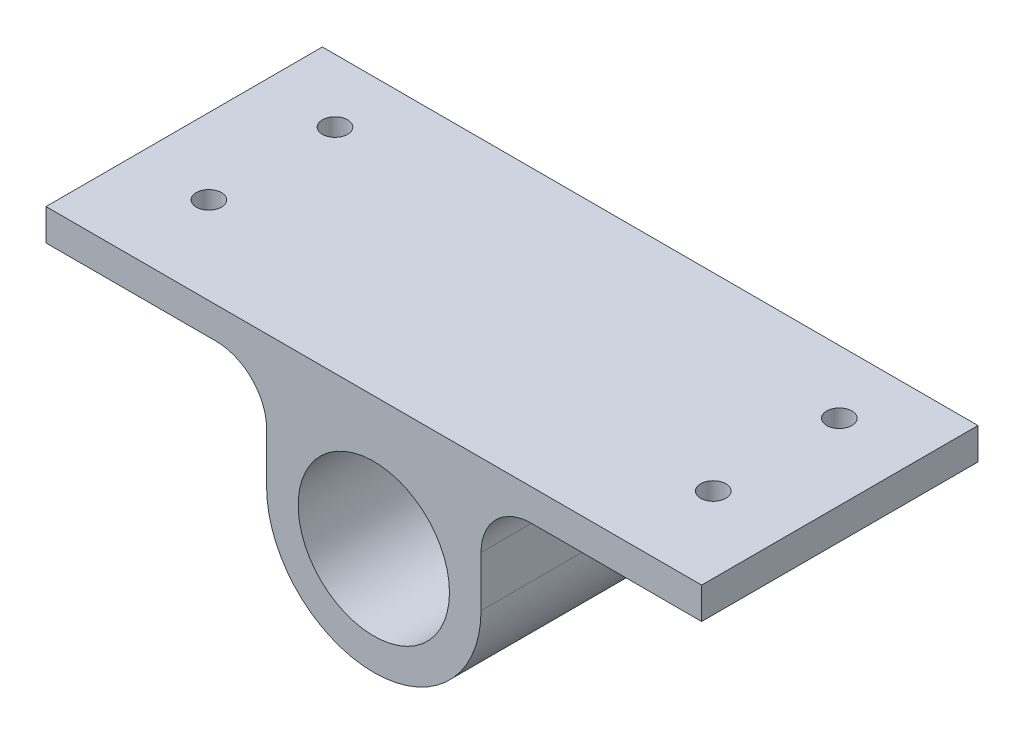
ISO-10303-21;
HEADER;
FILE_DESCRIPTION(('STEP AP214'),'2;1');
FILE_NAME('part.step','',(''),(''),'','','');
FILE_SCHEMA(('AUTOMOTIVE_DESIGN { 1 0 10303 214 1 1 1 1 }'));
ENDSEC;
DATA;
#1=APPLICATION_CONTEXT('core data for automotive mechanical design processes');
#2=APPLICATION_PROTOCOL_DEFINITION('international standard','automotive_design',2000,#1);
#3=PRODUCT_CONTEXT('',#1,'mechanical');
#4=PRODUCT('Part','Part','',(#3));
#5=PRODUCT_RELATED_PRODUCT_CATEGORY('part','',(#4));
#6=PRODUCT_DEFINITION_FORMATION('','',#4);
#7=PRODUCT_DEFINITION_CONTEXT('part definition',#1,'design');
#8=PRODUCT_DEFINITION('design','',#6,#7);
#9=PRODUCT_DEFINITION_SHAPE('','',#8);
#10=(LENGTH_UNIT() NAMED_UNIT(*) SI_UNIT(.MILLI.,.METRE.));
#11=(NAMED_UNIT(*) PLANE_ANGLE_UNIT() SI_UNIT($,.RADIAN.));
#12=(NAMED_UNIT(*) SI_UNIT($,.STERADIAN.) SOLID_ANGLE_UNIT());
#13=UNCERTAINTY_MEASURE_WITH_UNIT(LENGTH_MEASURE(1.E-05),#10,'distance_accuracy_value','');
#14=(GEOMETRIC_REPRESENTATION_CONTEXT(3) GLOBAL_UNCERTAINTY_ASSIGNED_CONTEXT((#13)) GLOBAL_UNIT_ASSIGNED_CONTEXT((#10,
#11,#12)) REPRESENTATION_CONTEXT('',''));
#15=CARTESIAN_POINT('',(0.,0.,0.));
#16=DIRECTION('',(0.,0.,1.));
#17=DIRECTION('',(1.,0.,0.));
#18=AXIS2_PLACEMENT_3D('',#15,#16,#17);
#19=CARTESIAN_POINT('',(0.,-7.9502,69.596));
#20=DIRECTION('',(0.,1.,0.));
#21=DIRECTION('',(0.,0.,1.));
#22=AXIS2_PLACEMENT_3D('',#19,#20,#21);
#23=PLANE('',#22);
#24=CARTESIAN_POINT('',(-63.5,-7.9502,15.875));
#25=DIRECTION('',(0.,1.,0.));
#26=DIRECTION('',(0.,0.,1.));
#27=AXIS2_PLACEMENT_3D('',#24,#25,#26);
#28=CIRCLE('',#27,3.175);
#29=CARTESIAN_POINT('',(-63.5,-7.9502,19.05));
#30=VERTEX_POINT('',#29);
#31=EDGE_CURVE('E165',#30,#30,#28,.T.);
#32=ORIENTED_EDGE('',*,*,#31,.T.);
#33=EDGE_LOOP('',(#32));
#34=FACE_BOUND('',#33,.T.);
#35=CARTESIAN_POINT('',(-63.5,-7.9502,47.625));
#36=DIRECTION('',(0.,1.,0.));
#37=DIRECTION('',(0.,0.,1.));
#38=AXIS2_PLACEMENT_3D('',#35,#36,#37);
#39=CIRCLE('',#38,3.175);
#40=CARTESIAN_POINT('',(-63.5,-7.9502,50.8));
#41=VERTEX_POINT('',#40);
#42=EDGE_CURVE('E333',#41,#41,#39,.T.);
#43=ORIENTED_EDGE('',*,*,#42,.T.);
#44=EDGE_LOOP('',(#43));
#45=FACE_BOUND('',#44,.T.);
#46=DIRECTION('',(1.,0.,0.));
#47=VECTOR('',#46,1.);
#48=CARTESIAN_POINT('',(0.,-7.9502,0.));
#49=LINE('',#48,#47);
#50=CARTESIAN_POINT('',(-82.55,-7.9502,0.));
#51=VERTEX_POINT('',#50);
#52=CARTESIAN_POINT('',(-39.7002000000001,-7.9502,0.));
#53=VERTEX_POINT('',#52);
#54=EDGE_CURVE('E164',#51,#53,#49,.T.);
#55=ORIENTED_EDGE('',*,*,#54,.T.);
#56=DIRECTION('',(0.,0.,-1.));
#57=VECTOR('',#56,1.);
#58=CARTESIAN_POINT('',(-39.7002000000001,-7.9502,69.596));
#59=LINE('',#58,#57);
#60=CARTESIAN_POINT('',(-39.7002000000001,-7.9502,69.596));
#61=VERTEX_POINT('',#60);
#62=EDGE_CURVE('E11',#61,#53,#59,.T.);
#63=ORIENTED_EDGE('',*,*,#62,.F.);
#64=DIRECTION('',(1.,0.,0.));
#65=VECTOR('',#64,1.);
#66=CARTESIAN_POINT('',(0.,-7.9502,69.596));
#67=LINE('',#66,#65);
#68=CARTESIAN_POINT('',(-82.55,-7.9502,69.596));
#69=VERTEX_POINT('',#68);
#70=EDGE_CURVE('E257',#69,#61,#67,.T.);
#71=ORIENTED_EDGE('',*,*,#70,.F.);
#72=DIRECTION('',(0.,0.,-1.));
#73=VECTOR('',#72,1.);
#74=CARTESIAN_POINT('',(-82.55,-7.9502,69.596));
#75=LINE('',#74,#73);
#76=EDGE_CURVE('E156',#69,#51,#75,.T.);
#77=ORIENTED_EDGE('',*,*,#76,.T.);
#78=EDGE_LOOP('',(#55,#63,#71,#77));
#79=FACE_BOUND('',#78,.T.);
#80=ADVANCED_FACE('F47',(#34,#45,#79),#23,.F.);
#81=CARTESIAN_POINT('',(-39.7002,-20.6502,69.596));
#82=DIRECTION('',(0.,0.,-1.));
#83=DIRECTION('',(-1.,0.,0.));
#84=AXIS2_PLACEMENT_3D('',#81,#82,#83);
#85=CYLINDRICAL_SURFACE('',#84,12.7);
#86=CARTESIAN_POINT('',(-39.7002,-20.6502,0.));
#87=DIRECTION('',(0.,0.,1.));
#88=DIRECTION('',(1.,0.,0.));
#89=AXIS2_PLACEMENT_3D('',#86,#87,#88);
#90=CIRCLE('',#89,12.7);
#91=CARTESIAN_POINT('',(-27.0002,-20.6502000000001,0.));
#92=VERTEX_POINT('',#91);
#93=EDGE_CURVE('E169',#53,#92,#90,.F.);
#94=ORIENTED_EDGE('',*,*,#93,.T.);
#95=DIRECTION('',(0.,0.,-1.));
#96=VECTOR('',#95,1.);
#97=CARTESIAN_POINT('',(-27.0002,-20.6502000000001,69.596));
#98=LINE('',#97,#96);
#99=CARTESIAN_POINT('',(-27.0002,-20.6502000000001,69.596));
#100=VERTEX_POINT('',#99);
#101=EDGE_CURVE('E57',#100,#92,#98,.T.);
#102=ORIENTED_EDGE('',*,*,#101,.F.);
#103=CARTESIAN_POINT('',(-39.7002,-20.6502,69.596));
#104=DIRECTION('',(0.,0.,1.));
#105=DIRECTION('',(1.,0.,0.));
#106=AXIS2_PLACEMENT_3D('',#103,#104,#105);
#107=CIRCLE('',#106,12.7);
#108=EDGE_CURVE('E110',#61,#100,#107,.F.);
#109=ORIENTED_EDGE('',*,*,#108,.F.);
#110=ORIENTED_EDGE('',*,*,#62,.T.);
#111=EDGE_LOOP('',(#94,#102,#109,#110));
#112=FACE_BOUND('',#111,.T.);
#113=ADVANCED_FACE('F271',(#112),#85,.F.);
#114=CARTESIAN_POINT('',(-27.0002,0.,69.596));
#115=DIRECTION('',(1.,0.,0.));
#116=DIRECTION('',(0.,0.,-1.));
#117=AXIS2_PLACEMENT_3D('',#114,#115,#116);
#118=PLANE('',#117);
#119=DIRECTION('',(0.,-1.,0.));
#120=VECTOR('',#119,1.);
#121=CARTESIAN_POINT('',(-27.0002,0.,0.));
#122=LINE('',#121,#120);
#123=CARTESIAN_POINT('',(-27.0002,-33.3502,0.));
#124=VERTEX_POINT('',#123);
#125=EDGE_CURVE('E172',#92,#124,#122,.T.);
#126=ORIENTED_EDGE('',*,*,#125,.T.);
#127=DIRECTION('',(0.,0.,-1.));
#128=VECTOR('',#127,1.);
#129=CARTESIAN_POINT('',(-27.0002,-33.3502,69.596));
#130=LINE('',#129,#128);
#131=CARTESIAN_POINT('',(-27.0002,-33.3502,69.596));
#132=VERTEX_POINT('',#131);
#133=EDGE_CURVE('E214',#132,#124,#130,.T.);
#134=ORIENTED_EDGE('',*,*,#133,.F.);
#135=DIRECTION('',(0.,-1.,0.));
#136=VECTOR('',#135,1.);
#137=CARTESIAN_POINT('',(-27.0002,0.,69.596));
#138=LINE('',#137,#136);
#139=EDGE_CURVE('E224',#100,#132,#138,.T.);
#140=ORIENTED_EDGE('',*,*,#139,.F.);
#141=ORIENTED_EDGE('',*,*,#101,.T.);
#142=EDGE_LOOP('',(#126,#134,#140,#141));
#143=FACE_BOUND('',#142,.T.);
#144=ADVANCED_FACE('F222',(#143),#118,.F.);
#145=CARTESIAN_POINT('',(0.,-33.3502,69.596));
#146=DIRECTION('',(0.,0.,-1.));
#147=DIRECTION('',(-1.,0.,0.));
#148=AXIS2_PLACEMENT_3D('',#145,#146,#147);
#149=CYLINDRICAL_SURFACE('',#148,27.0002);
#150=CARTESIAN_POINT('',(0.,-33.3502,0.));
#151=DIRECTION('',(0.,0.,1.));
#152=DIRECTION('',(1.,0.,0.));
#153=AXIS2_PLACEMENT_3D('',#150,#151,#152);
#154=CIRCLE('',#153,27.0002);
#155=CARTESIAN_POINT('',(27.0002,-33.3502,0.));
#156=VERTEX_POINT('',#155);
#157=EDGE_CURVE('E175',#124,#156,#154,.T.);
#158=ORIENTED_EDGE('',*,*,#157,.T.);
#159=DIRECTION('',(0.,0.,-1.));
#160=VECTOR('',#159,1.);
#161=CARTESIAN_POINT('',(27.0002,-33.3502,69.596));
#162=LINE('',#161,#160);
#163=CARTESIAN_POINT('',(27.0002,-33.3502,69.596));
#164=VERTEX_POINT('',#163);
#165=EDGE_CURVE('E211',#164,#156,#162,.T.);
#166=ORIENTED_EDGE('',*,*,#165,.F.);
#167=CARTESIAN_POINT('',(0.,-33.3502,69.596));
#168=DIRECTION('',(0.,0.,1.));
#169=DIRECTION('',(1.,0.,0.));
#170=AXIS2_PLACEMENT_3D('',#167,#168,#169);
#171=CIRCLE('',#170,27.0002);
#172=EDGE_CURVE('E235',#132,#164,#171,.T.);
#173=ORIENTED_EDGE('',*,*,#172,.F.);
#174=ORIENTED_EDGE('',*,*,#133,.T.);
#175=EDGE_LOOP('',(#158,#166,#173,#174));
#176=FACE_BOUND('',#175,.T.);
#177=ADVANCED_FACE('F232',(#176),#149,.T.);
#178=CARTESIAN_POINT('',(27.0002,0.,69.596));
#179=DIRECTION('',(1.,0.,0.));
#180=DIRECTION('',(0.,0.,-1.));
#181=AXIS2_PLACEMENT_3D('',#178,#179,#180);
#182=PLANE('',#181);
#183=DIRECTION('',(0.,-1.,0.));
#184=VECTOR('',#183,1.);
#185=CARTESIAN_POINT('',(27.0002,0.,0.));
#186=LINE('',#185,#184);
#187=CARTESIAN_POINT('',(27.0002,-20.6502000000001,0.));
#188=VERTEX_POINT('',#187);
#189=EDGE_CURVE('E179',#188,#156,#186,.T.);
#190=ORIENTED_EDGE('',*,*,#189,.F.);
#191=DIRECTION('',(0.,0.,-1.));
#192=VECTOR('',#191,1.);
#193=CARTESIAN_POINT('',(27.0002,-20.6502000000001,69.596));
#194=LINE('',#193,#192);
#195=CARTESIAN_POINT('',(27.0002,-20.6502000000001,69.596));
#196=VERTEX_POINT('',#195);
#197=EDGE_CURVE('E208',#196,#188,#194,.T.);
#198=ORIENTED_EDGE('',*,*,#197,.F.);
#199=DIRECTION('',(0.,-1.,0.));
#200=VECTOR('',#199,1.);
#201=CARTESIAN_POINT('',(27.0002,0.,69.596));
#202=LINE('',#201,#200);
#203=EDGE_CURVE('E238',#196,#164,#202,.T.);
#204=ORIENTED_EDGE('',*,*,#203,.T.);
#205=ORIENTED_EDGE('',*,*,#165,.T.);
#206=EDGE_LOOP('',(#190,#198,#204,#205));
#207=FACE_BOUND('',#206,.T.);
#208=ADVANCED_FACE('F286',(#207),#182,.T.);
#209=CARTESIAN_POINT('',(39.7002,-20.6502,69.596));
#210=DIRECTION('',(0.,0.,-1.));
#211=DIRECTION('',(-1.,0.,0.));
#212=AXIS2_PLACEMENT_3D('',#209,#210,#211);
#213=CYLINDRICAL_SURFACE('',#212,12.7);
#214=CARTESIAN_POINT('',(39.7002,-20.6502,0.));
#215=DIRECTION('',(0.,0.,1.));
#216=DIRECTION('',(1.,0.,0.));
#217=AXIS2_PLACEMENT_3D('',#214,#215,#216);
#218=CIRCLE('',#217,12.7);
#219=CARTESIAN_POINT('',(39.7002000000001,-7.9502,0.));
#220=VERTEX_POINT('',#219);
#221=EDGE_CURVE('E183',#220,#188,#218,.T.);
#222=ORIENTED_EDGE('',*,*,#221,.F.);
#223=DIRECTION('',(0.,0.,-1.));
#224=VECTOR('',#223,1.);
#225=CARTESIAN_POINT('',(39.7002000000001,-7.9502,69.596));
#226=LINE('',#225,#224);
#227=CARTESIAN_POINT('',(39.7002000000001,-7.9502,69.596));
#228=VERTEX_POINT('',#227);
#229=EDGE_CURVE('E205',#228,#220,#226,.T.);
#230=ORIENTED_EDGE('',*,*,#229,.F.);
#231=CARTESIAN_POINT('',(39.7002,-20.6502,69.596));
#232=DIRECTION('',(0.,0.,1.));
#233=DIRECTION('',(1.,0.,0.));
#234=AXIS2_PLACEMENT_3D('',#231,#232,#233);
#235=CIRCLE('',#234,12.7);
#236=EDGE_CURVE('E242',#228,#196,#235,.T.);
#237=ORIENTED_EDGE('',*,*,#236,.T.);
#238=ORIENTED_EDGE('',*,*,#197,.T.);
#239=EDGE_LOOP('',(#222,#230,#237,#238));
#240=FACE_BOUND('',#239,.T.);
#241=ADVANCED_FACE('F289',(#240),#213,.F.);
#242=CARTESIAN_POINT('',(0.,-7.9502,69.596));
#243=DIRECTION('',(0.,-1.,0.));
#244=DIRECTION('',(0.,0.,-1.));
#245=AXIS2_PLACEMENT_3D('',#242,#243,#244);
#246=PLANE('',#245);
#247=CARTESIAN_POINT('',(63.5,-7.9502,47.625));
#248=DIRECTION('',(0.,-1.,0.));
#249=DIRECTION('',(0.,0.,-1.));
#250=AXIS2_PLACEMENT_3D('',#247,#248,#249);
#251=CIRCLE('',#250,3.175);
#252=CARTESIAN_POINT('',(63.5,-7.9502,44.45));
#253=VERTEX_POINT('',#252);
#254=EDGE_CURVE('E324',#253,#253,#251,.T.);
#255=ORIENTED_EDGE('',*,*,#254,.F.);
#256=EDGE_LOOP('',(#255));
#257=FACE_BOUND('',#256,.T.);
#258=CARTESIAN_POINT('',(63.5,-7.9502,15.875));
#259=DIRECTION('',(0.,-1.,0.));
#260=DIRECTION('',(0.,0.,-1.));
#261=AXIS2_PLACEMENT_3D('',#258,#259,#260);
#262=CIRCLE('',#261,3.175);
#263=CARTESIAN_POINT('',(63.5,-7.9502,12.7));
#264=VERTEX_POINT('',#263);
#265=EDGE_CURVE('E319',#264,#264,#262,.T.);
#266=ORIENTED_EDGE('',*,*,#265,.F.);
#267=EDGE_LOOP('',(#266));
#268=FACE_BOUND('',#267,.T.);
#269=DIRECTION('',(-1.,0.,0.));
#270=VECTOR('',#269,1.);
#271=CARTESIAN_POINT('',(0.,-7.9502,0.));
#272=LINE('',#271,#270);
#273=CARTESIAN_POINT('',(82.55,-7.9502,0.));
#274=VERTEX_POINT('',#273);
#275=EDGE_CURVE('E187',#274,#220,#272,.T.);
#276=ORIENTED_EDGE('',*,*,#275,.F.);
#277=DIRECTION('',(0.,0.,-1.));
#278=VECTOR('',#277,1.);
#279=CARTESIAN_POINT('',(82.55,-7.9502,69.596));
#280=LINE('',#279,#278);
#281=CARTESIAN_POINT('',(82.55,-7.9502,69.596));
#282=VERTEX_POINT('',#281);
#283=EDGE_CURVE('E142',#282,#274,#280,.T.);
#284=ORIENTED_EDGE('',*,*,#283,.F.);
#285=DIRECTION('',(-1.,0.,0.));
#286=VECTOR('',#285,1.);
#287=CARTESIAN_POINT('',(0.,-7.9502,69.596));
#288=LINE('',#287,#286);
#289=EDGE_CURVE('E149',#282,#228,#288,.T.);
#290=ORIENTED_EDGE('',*,*,#289,.T.);
#291=ORIENTED_EDGE('',*,*,#229,.T.);
#292=EDGE_LOOP('',(#276,#284,#290,#291));
#293=FACE_BOUND('',#292,.T.);
#294=ADVANCED_FACE('F252',(#257,#268,#293),#246,.T.);
#295=CARTESIAN_POINT('',(82.55,0.,69.596));
#296=DIRECTION('',(1.,0.,0.));
#297=DIRECTION('',(0.,0.,-1.));
#298=AXIS2_PLACEMENT_3D('',#295,#296,#297);
#299=PLANE('',#298);
#300=DIRECTION('',(0.,-1.,0.));
#301=VECTOR('',#300,1.);
#302=CARTESIAN_POINT('',(82.55,0.,0.));
#303=LINE('',#302,#301);
#304=CARTESIAN_POINT('',(82.55,0.,0.));
#305=VERTEX_POINT('',#304);
#306=EDGE_CURVE('E136',#305,#274,#303,.T.);
#307=ORIENTED_EDGE('',*,*,#306,.F.);
#308=DIRECTION('',(0.,0.,-1.));
#309=VECTOR('',#308,1.);
#310=CARTESIAN_POINT('',(82.55,0.,69.596));
#311=LINE('',#310,#309);
#312=CARTESIAN_POINT('',(82.55,0.,69.596));
#313=VERTEX_POINT('',#312);
#314=EDGE_CURVE('E131',#313,#305,#311,.T.);
#315=ORIENTED_EDGE('',*,*,#314,.F.);
#316=DIRECTION('',(0.,-1.,0.));
#317=VECTOR('',#316,1.);
#318=CARTESIAN_POINT('',(82.55,0.,69.596));
#319=LINE('',#318,#317);
#320=EDGE_CURVE('E134',#313,#282,#319,.T.);
#321=ORIENTED_EDGE('',*,*,#320,.T.);
#322=ORIENTED_EDGE('',*,*,#283,.T.);
#323=EDGE_LOOP('',(#307,#315,#321,#322));
#324=FACE_BOUND('',#323,.T.);
#325=ADVANCED_FACE('F133',(#324),#299,.T.);
#326=CARTESIAN_POINT('',(0.,0.,69.596));
#327=DIRECTION('',(0.,1.,0.));
#328=DIRECTION('',(-1.,0.,0.));
#329=AXIS2_PLACEMENT_3D('',#326,#327,#328);
#330=PLANE('',#329);
#331=CARTESIAN_POINT('',(-63.5,0.,15.875));
#332=DIRECTION('',(0.,1.,0.));
#333=DIRECTION('',(1.,0.,0.));
#334=AXIS2_PLACEMENT_3D('',#331,#332,#333);
#335=CIRCLE('',#334,3.175);
#336=CARTESIAN_POINT('',(-60.325,0.,15.875));
#337=VERTEX_POINT('',#336);
#338=EDGE_CURVE('E305',#337,#337,#335,.T.);
#339=ORIENTED_EDGE('',*,*,#338,.F.);
#340=EDGE_LOOP('',(#339));
#341=FACE_BOUND('',#340,.T.);
#342=CARTESIAN_POINT('',(-63.5,0.,47.625));
#343=DIRECTION('',(0.,1.,0.));
#344=DIRECTION('',(1.,0.,0.));
#345=AXIS2_PLACEMENT_3D('',#342,#343,#344);
#346=CIRCLE('',#345,3.175);
#347=CARTESIAN_POINT('',(-60.325,0.,47.625));
#348=VERTEX_POINT('',#347);
#349=EDGE_CURVE('E309',#348,#348,#346,.T.);
#350=ORIENTED_EDGE('',*,*,#349,.F.);
#351=EDGE_LOOP('',(#350));
#352=FACE_BOUND('',#351,.T.);
#353=CARTESIAN_POINT('',(63.5,0.,47.625));
#354=DIRECTION('',(0.,1.,0.));
#355=DIRECTION('',(-1.,0.,0.));
#356=AXIS2_PLACEMENT_3D('',#353,#354,#355);
#357=CIRCLE('',#356,3.175);
#358=CARTESIAN_POINT('',(60.325,0.,47.625));
#359=VERTEX_POINT('',#358);
#360=EDGE_CURVE('E313',#359,#359,#357,.T.);
#361=ORIENTED_EDGE('',*,*,#360,.F.);
#362=EDGE_LOOP('',(#361));
#363=FACE_BOUND('',#362,.T.);
#364=CARTESIAN_POINT('',(63.5,0.,15.875));
#365=DIRECTION('',(0.,1.,0.));
#366=DIRECTION('',(-1.,0.,0.));
#367=AXIS2_PLACEMENT_3D('',#364,#365,#366);
#368=CIRCLE('',#367,3.175);
#369=CARTESIAN_POINT('',(60.325,0.,15.875));
#370=VERTEX_POINT('',#369);
#371=EDGE_CURVE('E316',#370,#370,#368,.T.);
#372=ORIENTED_EDGE('',*,*,#371,.F.);
#373=EDGE_LOOP('',(#372));
#374=FACE_BOUND('',#373,.T.);
#375=DIRECTION('',(1.,0.,0.));
#376=VECTOR('',#375,1.);
#377=CARTESIAN_POINT('',(0.,0.,0.));
#378=LINE('',#377,#376);
#379=CARTESIAN_POINT('',(-82.55,0.,0.));
#380=VERTEX_POINT('',#379);
#381=EDGE_CURVE('E193',#380,#305,#378,.T.);
#382=ORIENTED_EDGE('',*,*,#381,.F.);
#383=DIRECTION('',(0.,0.,-1.));
#384=VECTOR('',#383,1.);
#385=CARTESIAN_POINT('',(-82.55,0.,69.596));
#386=LINE('',#385,#384);
#387=CARTESIAN_POINT('',(-82.55,0.,69.596));
#388=VERTEX_POINT('',#387);
#389=EDGE_CURVE('E99',#388,#380,#386,.T.);
#390=ORIENTED_EDGE('',*,*,#389,.F.);
#391=DIRECTION('',(1.,0.,0.));
#392=VECTOR('',#391,1.);
#393=CARTESIAN_POINT('',(0.,0.,69.596));
#394=LINE('',#393,#392);
#395=EDGE_CURVE('E146',#388,#313,#394,.T.);
#396=ORIENTED_EDGE('',*,*,#395,.T.);
#397=ORIENTED_EDGE('',*,*,#314,.T.);
#398=EDGE_LOOP('',(#382,#390,#396,#397));
#399=FACE_BOUND('',#398,.T.);
#400=ADVANCED_FACE('F152',(#341,#352,#363,#374,#399),#330,.T.);
#401=CARTESIAN_POINT('',(0.,-33.3502,69.596));
#402=DIRECTION('',(0.,0.,-1.));
#403=DIRECTION('',(-1.,0.,0.));
#404=AXIS2_PLACEMENT_3D('',#401,#402,#403);
#405=CYLINDRICAL_SURFACE('',#404,19.05);
#406=CARTESIAN_POINT('',(0.,-33.3502,69.596));
#407=DIRECTION('',(0.,0.,1.));
#408=DIRECTION('',(1.,0.,0.));
#409=AXIS2_PLACEMENT_3D('',#406,#407,#408);
#410=CIRCLE('',#409,19.05);
#411=CARTESIAN_POINT('',(19.05,-33.3502,69.596));
#412=VERTEX_POINT('',#411);
#413=EDGE_CURVE('E198',#412,#412,#410,.T.);
#414=ORIENTED_EDGE('',*,*,#413,.T.);
#415=EDGE_LOOP('',(#414));
#416=FACE_BOUND('',#415,.T.);
#417=CARTESIAN_POINT('',(0.,-33.3502,0.));
#418=DIRECTION('',(0.,0.,1.));
#419=DIRECTION('',(1.,0.,0.));
#420=AXIS2_PLACEMENT_3D('',#417,#418,#419);
#421=CIRCLE('',#420,19.05);
#422=CARTESIAN_POINT('',(19.05,-33.3502,0.));
#423=VERTEX_POINT('',#422);
#424=EDGE_CURVE('E160',#423,#423,#421,.T.);
#425=ORIENTED_EDGE('',*,*,#424,.F.);
#426=EDGE_LOOP('',(#425));
#427=FACE_BOUND('',#426,.T.);
#428=ADVANCED_FACE('F49',(#416,#427),#405,.F.);
#429=CARTESIAN_POINT('',(-82.55,0.,69.596));
#430=DIRECTION('',(1.,0.,0.));
#431=DIRECTION('',(0.,0.,-1.));
#432=AXIS2_PLACEMENT_3D('',#429,#430,#431);
#433=PLANE('',#432);
#434=DIRECTION('',(0.,-1.,0.));
#435=VECTOR('',#434,1.);
#436=CARTESIAN_POINT('',(-82.55,0.,0.));
#437=LINE('',#436,#435);
#438=EDGE_CURVE('E102',#380,#51,#437,.T.);
#439=ORIENTED_EDGE('',*,*,#438,.T.);
#440=ORIENTED_EDGE('',*,*,#76,.F.);
#441=DIRECTION('',(0.,-1.,0.));
#442=VECTOR('',#441,1.);
#443=CARTESIAN_POINT('',(-82.55,0.,69.596));
#444=LINE('',#443,#442);
#445=EDGE_CURVE('E65',#388,#69,#444,.T.);
#446=ORIENTED_EDGE('',*,*,#445,.F.);
#447=ORIENTED_EDGE('',*,*,#389,.T.);
#448=EDGE_LOOP('',(#439,#440,#446,#447));
#449=FACE_BOUND('',#448,.T.);
#450=ADVANCED_FACE('F258',(#449),#433,.F.);
#451=CARTESIAN_POINT('',(0.,0.,69.596));
#452=DIRECTION('',(0.,0.,1.));
#453=DIRECTION('',(1.,0.,0.));
#454=AXIS2_PLACEMENT_3D('',#451,#452,#453);
#455=PLANE('',#454);
#456=ORIENTED_EDGE('',*,*,#413,.F.);
#457=EDGE_LOOP('',(#456));
#458=FACE_BOUND('',#457,.T.);
#459=ORIENTED_EDGE('',*,*,#70,.T.);
#460=ORIENTED_EDGE('',*,*,#108,.T.);
#461=ORIENTED_EDGE('',*,*,#139,.T.);
#462=ORIENTED_EDGE('',*,*,#172,.T.);
#463=ORIENTED_EDGE('',*,*,#203,.F.);
#464=ORIENTED_EDGE('',*,*,#236,.F.);
#465=ORIENTED_EDGE('',*,*,#289,.F.);
#466=ORIENTED_EDGE('',*,*,#320,.F.);
#467=ORIENTED_EDGE('',*,*,#395,.F.);
#468=ORIENTED_EDGE('',*,*,#445,.T.);
#469=EDGE_LOOP('',(#459,#460,#461,#462,#463,#464,#465,#466,#467,#468));
#470=FACE_BOUND('',#469,.T.);
#471=ADVANCED_FACE('F145',(#458,#470),#455,.T.);
#472=CARTESIAN_POINT('',(0.,0.,0.));
#473=DIRECTION('',(0.,0.,1.));
#474=DIRECTION('',(1.,0.,0.));
#475=AXIS2_PLACEMENT_3D('',#472,#473,#474);
#476=PLANE('',#475);
#477=ORIENTED_EDGE('',*,*,#424,.T.);
#478=EDGE_LOOP('',(#477));
#479=FACE_BOUND('',#478,.T.);
#480=ORIENTED_EDGE('',*,*,#54,.F.);
#481=ORIENTED_EDGE('',*,*,#438,.F.);
#482=ORIENTED_EDGE('',*,*,#381,.T.);
#483=ORIENTED_EDGE('',*,*,#306,.T.);
#484=ORIENTED_EDGE('',*,*,#275,.T.);
#485=ORIENTED_EDGE('',*,*,#221,.T.);
#486=ORIENTED_EDGE('',*,*,#189,.T.);
#487=ORIENTED_EDGE('',*,*,#157,.F.);
#488=ORIENTED_EDGE('',*,*,#125,.F.);
#489=ORIENTED_EDGE('',*,*,#93,.F.);
#490=EDGE_LOOP('',(#480,#481,#482,#483,#484,#485,#486,#487,#488,#489));
#491=FACE_BOUND('',#490,.T.);
#492=ADVANCED_FACE('F228',(#479,#491),#476,.F.);
#493=CARTESIAN_POINT('',(63.5,-63.5,15.875));
#494=DIRECTION('',(0.,1.,0.));
#495=DIRECTION('',(-1.,0.,0.));
#496=AXIS2_PLACEMENT_3D('',#493,#494,#495);
#497=CYLINDRICAL_SURFACE('',#496,3.175);
#498=ORIENTED_EDGE('',*,*,#265,.T.);
#499=EDGE_LOOP('',(#498));
#500=FACE_BOUND('',#499,.T.);
#501=ORIENTED_EDGE('',*,*,#371,.T.);
#502=EDGE_LOOP('',(#501));
#503=FACE_BOUND('',#502,.T.);
#504=ADVANCED_FACE('F348',(#500,#503),#497,.F.);
#505=CARTESIAN_POINT('',(63.5,-63.5,47.625));
#506=DIRECTION('',(0.,1.,0.));
#507=DIRECTION('',(-1.,0.,0.));
#508=AXIS2_PLACEMENT_3D('',#505,#506,#507);
#509=CYLINDRICAL_SURFACE('',#508,3.175);
#510=ORIENTED_EDGE('',*,*,#254,.T.);
#511=EDGE_LOOP('',(#510));
#512=FACE_BOUND('',#511,.T.);
#513=ORIENTED_EDGE('',*,*,#360,.T.);
#514=EDGE_LOOP('',(#513));
#515=FACE_BOUND('',#514,.T.);
#516=ADVANCED_FACE('F351',(#512,#515),#509,.F.);
#517=CARTESIAN_POINT('',(-63.5,-63.5,47.625));
#518=DIRECTION('',(0.,1.,0.));
#519=DIRECTION('',(-1.,0.,0.));
#520=AXIS2_PLACEMENT_3D('',#517,#518,#519);
#521=CYLINDRICAL_SURFACE('',#520,3.175);
#522=ORIENTED_EDGE('',*,*,#349,.T.);
#523=EDGE_LOOP('',(#522));
#524=FACE_BOUND('',#523,.T.);
#525=ORIENTED_EDGE('',*,*,#42,.F.);
#526=EDGE_LOOP('',(#525));
#527=FACE_BOUND('',#526,.T.);
#528=ADVANCED_FACE('F358',(#524,#527),#521,.F.);
#529=CARTESIAN_POINT('',(-63.5,-63.5,15.875));
#530=DIRECTION('',(0.,1.,0.));
#531=DIRECTION('',(-1.,0.,0.));
#532=AXIS2_PLACEMENT_3D('',#529,#530,#531);
#533=CYLINDRICAL_SURFACE('',#532,3.175);
#534=ORIENTED_EDGE('',*,*,#338,.T.);
#535=EDGE_LOOP('',(#534));
#536=FACE_BOUND('',#535,.T.);
#537=ORIENTED_EDGE('',*,*,#31,.F.);
#538=EDGE_LOOP('',(#537));
#539=FACE_BOUND('',#538,.T.);
#540=ADVANCED_FACE('F355',(#536,#539),#533,.F.);
#541=CLOSED_SHELL('',(#80,#113,#144,#177,#208,#241,#294,#325,#400,#428,#450,#471,#492,#504,#516,
#528,#540));
#542=MANIFOLD_SOLID_BREP('B2',#541);
#543=ADVANCED_BREP_SHAPE_REPRESENTATION('',(#18,#542),#14);
#544=SHAPE_DEFINITION_REPRESENTATION(#9,#543);
ENDSEC;
END-ISO-10303-21;
